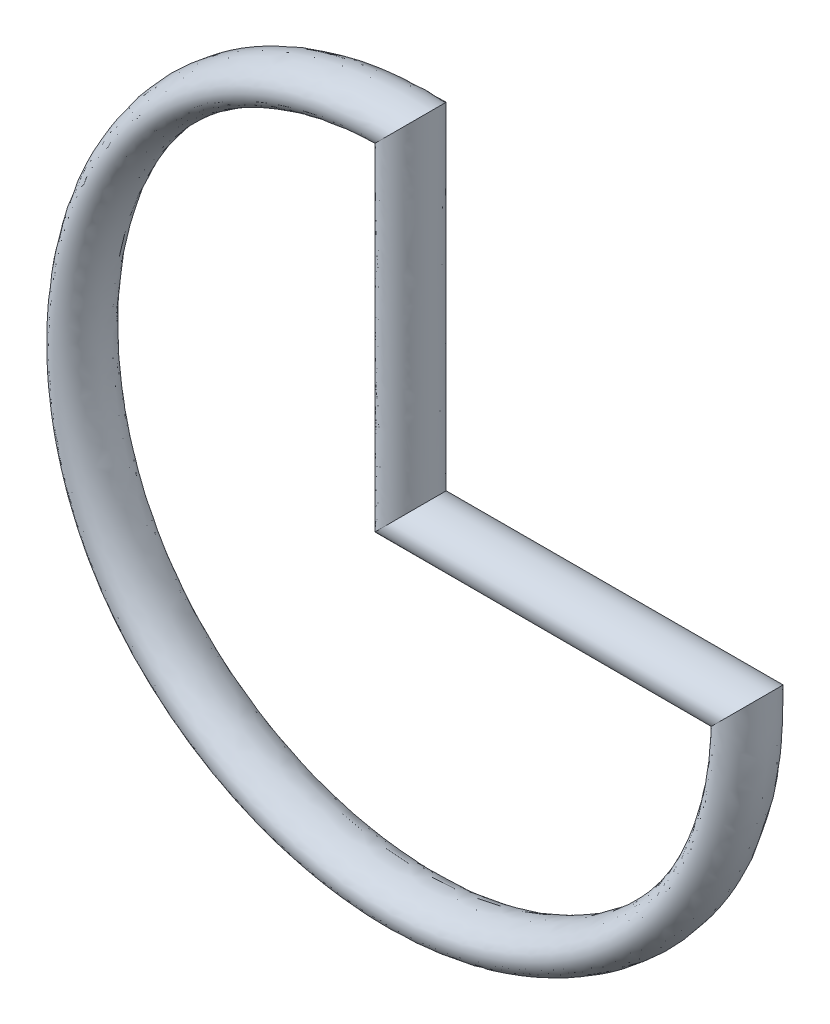
ISO-10303-21;
HEADER;
FILE_DESCRIPTION(('STEP AP214'),'2;1');
FILE_NAME('part.step','',(''),(''),'','','');
FILE_SCHEMA(('AUTOMOTIVE_DESIGN { 1 0 10303 214 1 1 1 1 }'));
ENDSEC;
DATA;
#1=APPLICATION_CONTEXT('core data for automotive mechanical design processes');
#2=APPLICATION_PROTOCOL_DEFINITION('international standard','automotive_design',2000,#1);
#3=PRODUCT_CONTEXT('',#1,'mechanical');
#4=PRODUCT('Part','Part','',(#3));
#5=PRODUCT_RELATED_PRODUCT_CATEGORY('part','',(#4));
#6=PRODUCT_DEFINITION_FORMATION('','',#4);
#7=PRODUCT_DEFINITION_CONTEXT('part definition',#1,'design');
#8=PRODUCT_DEFINITION('design','',#6,#7);
#9=PRODUCT_DEFINITION_SHAPE('','',#8);
#10=(LENGTH_UNIT() NAMED_UNIT(*) SI_UNIT(.MILLI.,.METRE.));
#11=(NAMED_UNIT(*) PLANE_ANGLE_UNIT() SI_UNIT($,.RADIAN.));
#12=(NAMED_UNIT(*) SI_UNIT($,.STERADIAN.) SOLID_ANGLE_UNIT());
#13=UNCERTAINTY_MEASURE_WITH_UNIT(LENGTH_MEASURE(1.E-05),#10,'distance_accuracy_value','');
#14=(GEOMETRIC_REPRESENTATION_CONTEXT(3) GLOBAL_UNCERTAINTY_ASSIGNED_CONTEXT((#13)) GLOBAL_UNIT_ASSIGNED_CONTEXT((#10,
#11,#12)) REPRESENTATION_CONTEXT('',''));
#15=CARTESIAN_POINT('',(0.,0.,0.));
#16=DIRECTION('',(0.,0.,1.));
#17=DIRECTION('',(1.,0.,0.));
#18=AXIS2_PLACEMENT_3D('',#15,#16,#17);
#19=CARTESIAN_POINT('',(0.0176776695296638,-0.217677669529664,0.));
#20=CARTESIAN_POINT('',(0.0176776695296638,0.471479339474909,0.));
#21=CARTESIAN_POINT('',(0.0176776695296638,-0.217677669529664,0.05));
#22=CARTESIAN_POINT('',(0.0176776695296638,0.471479339474909,0.05));
#23=CARTESIAN_POINT('',(-0.0176776695296638,-0.182322330470336,0.05));
#24=CARTESIAN_POINT('',(-0.0176776695296638,0.506834678534236,0.05));
#25=CARTESIAN_POINT('',(-0.0176776695296638,-0.182322330470336,0.));
#26=CARTESIAN_POINT('',(-0.0176776695296638,0.506834678534236,0.));
#27=CARTESIAN_POINT('',(-0.0176776695296638,-0.182322330470336,-0.05));
#28=CARTESIAN_POINT('',(-0.0176776695296638,0.506834678534236,-0.05));
#29=CARTESIAN_POINT('',(0.0176776695296638,-0.217677669529664,-0.05));
#30=CARTESIAN_POINT('',(0.0176776695296638,0.471479339474909,-0.05));
#31=CARTESIAN_POINT('',(0.0176776695296638,-0.217677669529664,0.));
#32=CARTESIAN_POINT('',(0.0176776695296638,0.471479339474909,0.));
#33=(BOUNDED_SURFACE() B_SPLINE_SURFACE(3,1,((#19,#20),(#21,#22),(#23,#24),(#25,#26),(#27,#28),
(#29,#30),(#31,#32)),.UNSPECIFIED.,.T.,.F.,.F.) B_SPLINE_SURFACE_WITH_KNOTS((4,3,4),(2,2),(0.,
0.5,1.),(0.,1.),.UNSPECIFIED.) GEOMETRIC_REPRESENTATION_ITEM() RATIONAL_B_SPLINE_SURFACE(((1.,
1.),(0.333333333333333,0.333333333333333),(0.333333333333333,0.333333333333333),(1.,1.),
(0.333333333333333,0.333333333333333),(0.333333333333333,0.333333333333333),(1.,1.))) REPRESENTATION_ITEM('') SURFACE());
#34=CARTESIAN_POINT('',(0.,0.,0.));
#35=DIRECTION('',(0.707106781186552,-0.707106781186543,0.));
#36=DIRECTION('',(0.707106781186543,0.707106781186552,0.));
#37=AXIS2_PLACEMENT_3D('',#34,#35,#36);
#38=CIRCLE('',#37,0.025);
#39=CARTESIAN_POINT('',(0.0176776695296637,0.0176776695296638,0.));
#40=VERTEX_POINT('',#39);
#41=EDGE_CURVE('E60',#40,#40,#38,.T.);
#42=CARTESIAN_POINT('',(0.,0.289157009004573,0.));
#43=DIRECTION('',(0.707106781186552,-0.707106781186543,0.));
#44=DIRECTION('',(0.707106781186543,0.707106781186552,0.));
#45=AXIS2_PLACEMENT_3D('',#42,#43,#44);
#46=CIRCLE('',#45,0.025);
#47=CARTESIAN_POINT('',(0.0176776695296637,0.306834678534236,0.));
#48=VERTEX_POINT('',#47);
#49=EDGE_CURVE('E55',#48,#48,#46,.T.);
#50=ORIENTED_EDGE('',*,*,#41,.F.);
#51=EDGE_LOOP('',(#50));
#52=FACE_BOUND('',#51,.T.);
#53=ORIENTED_EDGE('',*,*,#49,.T.);
#54=EDGE_LOOP('',(#53));
#55=FACE_BOUND('',#54,.T.);
#56=ADVANCED_FACE('F45',(#52,#55),#33,.F.);
#57=CARTESIAN_POINT('',(0.306834678534236,0.0176776695296638,0.));
#58=CARTESIAN_POINT('',(0.0176776695296635,0.0176776695296638,0.));
#59=CARTESIAN_POINT('',(0.306834678534236,0.0176776695296638,0.05));
#60=CARTESIAN_POINT('',(0.0176776695296636,0.0176776695296638,0.05));
#61=CARTESIAN_POINT('',(0.271479339474909,-0.0176776695296638,0.05));
#62=CARTESIAN_POINT('',(-0.0176776695296636,-0.0176776695296638,0.05));
#63=CARTESIAN_POINT('',(0.271479339474909,-0.0176776695296638,0.));
#64=CARTESIAN_POINT('',(-0.0176776695296636,-0.0176776695296638,0.));
#65=CARTESIAN_POINT('',(0.271479339474909,-0.0176776695296638,-0.05));
#66=CARTESIAN_POINT('',(-0.0176776695296636,-0.0176776695296638,-0.05));
#67=CARTESIAN_POINT('',(0.306834678534236,0.0176776695296638,-0.05));
#68=CARTESIAN_POINT('',(0.0176776695296636,0.0176776695296638,-0.05));
#69=CARTESIAN_POINT('',(0.306834678534236,0.0176776695296638,0.));
#70=CARTESIAN_POINT('',(0.0176776695296635,0.0176776695296638,0.));
#71=(BOUNDED_SURFACE() B_SPLINE_SURFACE(3,1,((#57,#58),(#59,#60),(#61,#62),(#63,#64),(#65,#66),
(#67,#68),(#69,#70)),.UNSPECIFIED.,.T.,.F.,.F.) B_SPLINE_SURFACE_WITH_KNOTS((4,3,4),(2,2),(0.,
0.5,1.),(0.,1.),.UNSPECIFIED.) GEOMETRIC_REPRESENTATION_ITEM() RATIONAL_B_SPLINE_SURFACE(((1.,
1.),(0.333333333333333,0.333333333333333),(0.333333333333333,0.333333333333333),(1.,1.),
(0.333333333333333,0.333333333333333),(0.333333333333333,0.333333333333333),(1.,1.))) REPRESENTATION_ITEM('') SURFACE());
#72=CARTESIAN_POINT('',(0.307588855904687,0.0184318525656674,0.));
#73=CARTESIAN_POINT('',(0.307588442140184,0.0184314389987421,-0.00228138235617758));
#74=CARTESIAN_POINT('',(0.307351140834626,0.0181941335101052,-0.00456446048784308));
#75=CARTESIAN_POINT('',(0.306352569672693,0.0171955587202148,-0.00928990774502268));
#76=CARTESIAN_POINT('',(0.305513794045936,0.0163567845103321,-0.0116996400396007));
#77=CARTESIAN_POINT('',(0.303312909803522,0.0141559013482563,-0.0160993310885314));
#78=CARTESIAN_POINT('',(0.301933783834519,0.0127767749806945,-0.0180719889062247));
#79=CARTESIAN_POINT('',(0.298725329886001,0.00956832072135534,-0.0214370679595718));
#80=CARTESIAN_POINT('',(0.296873430407738,0.0077164213624369,-0.0227860486977412));
#81=CARTESIAN_POINT('',(0.292866593795671,0.00370958483582984,-0.0246320580256332));
#82=CARTESIAN_POINT('',(0.290701588595511,0.00154457959442521,-0.0250866950215473));
#83=CARTESIAN_POINT('',(0.286471052387676,-0.00268595662459014,-0.0248874304697885));
#84=CARTESIAN_POINT('',(0.284404619604599,-0.00475238937994638,-0.0242701767915893));
#85=CARTESIAN_POINT('',(0.28052043901278,-0.00863657001482794,-0.0221362446850032));
#86=CARTESIAN_POINT('',(0.278703053112835,-0.0104539559856962,-0.0206182740659246));
#87=CARTESIAN_POINT('',(0.275468775940526,-0.0136882331611209,-0.016769669567308));
#88=CARTESIAN_POINT('',(0.274064228084675,-0.0150927809453064,-0.0144179004067161));
#89=CARTESIAN_POINT('',(0.271990526062095,-0.0171664829181846,-0.0092656926604513));
#90=CARTESIAN_POINT('',(0.27129178826337,-0.0178652207348995,-0.0064894901958799));
#91=CARTESIAN_POINT('',(0.270676937379016,-0.0184800716314522,-0.000955270811405133));
#92=CARTESIAN_POINT('',(0.270712233964348,-0.0184447750418195,0.00179186289976565));
#93=CARTESIAN_POINT('',(0.271428244307559,-0.0177287646954634,0.00702638644621134));
#94=CARTESIAN_POINT('',(0.272090567769547,-0.0170664412344794,0.00951894239526535));
#95=CARTESIAN_POINT('',(0.273957481939246,-0.0151995270658887,0.0141478059193135));
#96=CARTESIAN_POINT('',(0.275177170721918,-0.0139798382832954,0.0162717562253384));
#97=CARTESIAN_POINT('',(0.27809956441794,-0.0110574445859507,0.0200139126344512));
#98=CARTESIAN_POINT('',(0.279828004089238,-0.00932900491315805,0.0215914838062708));
#99=CARTESIAN_POINT('',(0.283644110387583,-0.00551289861927556,0.0239675169829038));
#100=CARTESIAN_POINT('',(0.285745432270411,-0.00341157674278154,0.0247230041002524));
#101=CARTESIAN_POINT('',(0.289971700216623,0.000814691214449004,0.0251433367965496));
#102=CARTESIAN_POINT('',(0.292095858412714,0.00293884942755021,0.0248238821976317));
#103=CARTESIAN_POINT('',(0.296109628255303,0.00695261923319442,0.0232462262569654));
#104=CARTESIAN_POINT('',(0.298003080485771,0.00884607141111891,0.0220069232826995));
#105=CARTESIAN_POINT('',(0.301496983721315,0.0123399749998873,0.0186619269886865));
#106=CARTESIAN_POINT('',(0.303079817538676,0.0139228092443395,0.0165187889062634));
#107=CARTESIAN_POINT('',(0.305555694972274,0.016398685284331,0.0116572239522556));
#108=CARTESIAN_POINT('',(0.306472565545227,0.017315554121,0.00896362395733287));
#109=CARTESIAN_POINT('',(0.307394963929674,0.0182379566330311,0.00413455729902344));
#110=CARTESIAN_POINT('',(0.307589230964476,0.0184322274463602,0.00206797532881249));
#111=CARTESIAN_POINT('',(0.307588855904687,0.0184318525656674,0.));
#112=B_SPLINE_CURVE_WITH_KNOTS('',3,(#72,#73,#74,#75,#76,#77,#78,#79,#80,#81,#82,#83,#84,#85,
#86,#87,#88,#89,#90,#91,#92,#93,#94,#95,#96,#97,#98,#99,#100,#101,#102,#103,#104,#105,#106,#107,
#108,#109,#110,#111),.UNSPECIFIED.,.T.,.F.,(4,2,2,2,2,2,2,2,2,2,2,2,2,2,2,2,2,2,2,4),(0.,
0.00682494863499154,0.0147380166595046,0.0229234178124496,0.0316151517196782,0.0407097970105657,
0.0494995857144881,0.0583020150578078,0.0673457267692713,0.0759923204241758,0.0840684793577621,
0.0919148764572583,0.0999877188832668,0.108572727396436,0.117587678099275,0.126471537812964,
0.135177760938634,0.144286938233325,0.153051556883128,0.15923808031238),.UNSPECIFIED.);
#113=CARTESIAN_POINT('',(0.307211765768654,0.0180547595968904,0.));
#114=VERTEX_POINT('',#113);
#115=EDGE_CURVE('E12',#114,#114,#112,.T.);
#116=ORIENTED_EDGE('',*,*,#41,.T.);
#117=EDGE_LOOP('',(#116));
#118=FACE_BOUND('',#117,.T.);
#119=ORIENTED_EDGE('',*,*,#115,.T.);
#120=EDGE_LOOP('',(#119));
#121=FACE_BOUND('',#120,.T.);
#122=ADVANCED_FACE('F89',(#118,#121),#71,.F.);
#123=CARTESIAN_POINT('',(0.0176776695296636,0.306834678534236,0.));
#124=CARTESIAN_POINT('',(-0.264134510497059,0.323069197760971,0.));
#125=CARTESIAN_POINT('',(-0.389986917014371,-0.0243157556052428,0.));
#126=CARTESIAN_POINT('',(-0.149203864334944,-0.294539445039508,0.));
#127=CARTESIAN_POINT('',(-0.0189094824571877,-0.329476904824197,0.));
#128=CARTESIAN_POINT('',(0.209658583789563,-0.254864485243051,0.));
#129=CARTESIAN_POINT('',(0.302657229054855,-0.154462148316479,0.));
#130=CARTESIAN_POINT('',(0.308931983804661,0.0509955268040813,0.));
#131=CARTESIAN_POINT('',(0.306834678534236,0.115655663803662,0.));
#132=CARTESIAN_POINT('',(0.306834678534236,0.182322330470336,0.));
#133=CARTESIAN_POINT('',(0.0176776695296636,0.306834678534236,0.05));
#134=CARTESIAN_POINT('',(-0.264134510497059,0.323069197760971,0.05));
#135=CARTESIAN_POINT('',(-0.389986917014371,-0.0243157556052428,0.05));
#136=CARTESIAN_POINT('',(-0.149203864334944,-0.294539445039508,0.05));
#137=CARTESIAN_POINT('',(-0.0189094824571877,-0.329476904824197,0.05));
#138=CARTESIAN_POINT('',(0.209658583789563,-0.254864485243051,0.05));
#139=CARTESIAN_POINT('',(0.302657229054855,-0.154462148316479,0.05));
#140=CARTESIAN_POINT('',(0.308931983804661,0.0509955268040813,0.05));
#141=CARTESIAN_POINT('',(0.306834678534236,0.115655663803662,0.05));
#142=CARTESIAN_POINT('',(0.306834678534236,0.182322330470336,0.05));
#143=CARTESIAN_POINT('',(-0.0176776695296636,0.271479339474909,0.05));
#144=CARTESIAN_POINT('',(-0.267017587967985,0.255241948270952,0.05));
#145=CARTESIAN_POINT('',(-0.339986917014371,-0.0635699379450338,0.05));
#146=CARTESIAN_POINT('',(-0.0992038643349442,-0.274912353869612,0.05));
#147=CARTESIAN_POINT('',(0.0190460031692673,-0.2915047267576,0.05));
#148=CARTESIAN_POINT('',(0.211776704614099,-0.20121730909881,0.05));
#149=CARTESIAN_POINT('',(0.275427536950894,-0.111009193032695,0.05));
#150=CARTESIAN_POINT('',(0.269497131092514,0.0822854251514972,0.05));
#151=CARTESIAN_POINT('',(0.271479339474909,0.151011002862989,0.05));
#152=CARTESIAN_POINT('',(0.271479339474909,0.217677669529664,0.05));
#153=CARTESIAN_POINT('',(-0.0176776695296636,0.271479339474909,0.));
#154=CARTESIAN_POINT('',(-0.267017587967985,0.255241948270952,0.));
#155=CARTESIAN_POINT('',(-0.339986917014371,-0.0635699379450338,0.));
#156=CARTESIAN_POINT('',(-0.0992038643349442,-0.274912353869612,0.));
#157=CARTESIAN_POINT('',(0.0190460031692673,-0.2915047267576,0.));
#158=CARTESIAN_POINT('',(0.211776704614099,-0.20121730909881,0.));
#159=CARTESIAN_POINT('',(0.275427536950894,-0.111009193032695,0.));
#160=CARTESIAN_POINT('',(0.269497131092514,0.0822854251514972,0.));
#161=CARTESIAN_POINT('',(0.271479339474909,0.151011002862989,0.));
#162=CARTESIAN_POINT('',(0.271479339474909,0.217677669529664,0.));
#163=CARTESIAN_POINT('',(-0.0176776695296636,0.271479339474909,-0.05));
#164=CARTESIAN_POINT('',(-0.267017587967985,0.255241948270952,-0.05));
#165=CARTESIAN_POINT('',(-0.339986917014371,-0.0635699379450338,-0.05));
#166=CARTESIAN_POINT('',(-0.0992038643349442,-0.274912353869612,-0.05));
#167=CARTESIAN_POINT('',(0.0190460031692673,-0.2915047267576,-0.05));
#168=CARTESIAN_POINT('',(0.211776704614099,-0.20121730909881,-0.05));
#169=CARTESIAN_POINT('',(0.275427536950894,-0.111009193032695,-0.05));
#170=CARTESIAN_POINT('',(0.269497131092514,0.0822854251514972,-0.05));
#171=CARTESIAN_POINT('',(0.271479339474909,0.151011002862989,-0.05));
#172=CARTESIAN_POINT('',(0.271479339474909,0.217677669529664,-0.05));
#173=CARTESIAN_POINT('',(0.0176776695296636,0.306834678534236,-0.05));
#174=CARTESIAN_POINT('',(-0.264134510497059,0.323069197760971,-0.05));
#175=CARTESIAN_POINT('',(-0.389986917014371,-0.0243157556052428,-0.05));
#176=CARTESIAN_POINT('',(-0.149203864334944,-0.294539445039508,-0.05));
#177=CARTESIAN_POINT('',(-0.0189094824571877,-0.329476904824197,-0.05));
#178=CARTESIAN_POINT('',(0.209658583789563,-0.254864485243051,-0.05));
#179=CARTESIAN_POINT('',(0.302657229054855,-0.154462148316479,-0.05));
#180=CARTESIAN_POINT('',(0.308931983804661,0.0509955268040813,-0.05));
#181=CARTESIAN_POINT('',(0.306834678534236,0.115655663803662,-0.05));
#182=CARTESIAN_POINT('',(0.306834678534236,0.182322330470336,-0.05));
#183=CARTESIAN_POINT('',(0.0176776695296636,0.306834678534236,0.));
#184=CARTESIAN_POINT('',(-0.264134510497059,0.323069197760971,0.));
#185=CARTESIAN_POINT('',(-0.389986917014371,-0.0243157556052428,0.));
#186=CARTESIAN_POINT('',(-0.149203864334944,-0.294539445039508,0.));
#187=CARTESIAN_POINT('',(-0.0189094824571877,-0.329476904824197,0.));
#188=CARTESIAN_POINT('',(0.209658583789563,-0.254864485243051,0.));
#189=CARTESIAN_POINT('',(0.302657229054855,-0.154462148316479,0.));
#190=CARTESIAN_POINT('',(0.308931983804661,0.0509955268040813,0.));
#191=CARTESIAN_POINT('',(0.306834678534236,0.115655663803662,0.));
#192=CARTESIAN_POINT('',(0.306834678534236,0.182322330470336,0.));
#193=(BOUNDED_SURFACE() B_SPLINE_SURFACE(3,3,((#123,#124,#125,#126,#127,#128,#129,#130,#131,
#132),(#133,#134,#135,#136,#137,#138,#139,#140,#141,#142),(#143,#144,#145,#146,#147,#148,#149,
#150,#151,#152),(#153,#154,#155,#156,#157,#158,#159,#160,#161,#162),(#163,#164,#165,#166,#167,
#168,#169,#170,#171,#172),(#173,#174,#175,#176,#177,#178,#179,#180,#181,#182),(#183,#184,#185,
#186,#187,#188,#189,#190,#191,#192)),.UNSPECIFIED.,.T.,.F.,.F.) B_SPLINE_SURFACE_WITH_KNOTS((4,
3,4),(4,2,2,2,4),(0.,0.5,1.),(0.,0.5,0.75,1.,1.12551350296252),
.UNSPECIFIED.) GEOMETRIC_REPRESENTATION_ITEM() RATIONAL_B_SPLINE_SURFACE(((1.,1.,1.,1.,1.,1.,1.,
1.,1.,1.),(0.333333333333333,0.333333333333333,0.333333333333333,0.333333333333333,
0.333333333333333,0.333333333333333,0.333333333333333,0.333333333333333,0.333333333333333,
0.333333333333333),(0.333333333333333,0.333333333333333,0.333333333333333,0.333333333333333,
0.333333333333333,0.333333333333333,0.333333333333333,0.333333333333333,0.333333333333333,
0.333333333333333),(1.,1.,1.,1.,1.,1.,1.,1.,1.,1.),(0.333333333333333,0.333333333333333,
0.333333333333333,0.333333333333333,0.333333333333333,0.333333333333333,0.333333333333333,
0.333333333333333,0.333333333333333,0.333333333333333),(0.333333333333333,0.333333333333333,
0.333333333333333,0.333333333333333,0.333333333333333,0.333333333333333,0.333333333333333,
0.333333333333333,0.333333333333333,0.333333333333333),(1.,1.,1.,1.,1.,1.,1.,1.,1.,1.))) REPRESENTATION_ITEM('') SURFACE());
#194=ORIENTED_EDGE('',*,*,#49,.F.);
#195=EDGE_LOOP('',(#194));
#196=FACE_BOUND('',#195,.T.);
#197=ORIENTED_EDGE('',*,*,#115,.F.);
#198=EDGE_LOOP('',(#197));
#199=FACE_BOUND('',#198,.T.);
#200=ADVANCED_FACE('F69',(#196,#199),#193,.F.);
#201=CLOSED_SHELL('',(#56,#122,#200));
#202=MANIFOLD_SOLID_BREP('B2',#201);
#203=ADVANCED_BREP_SHAPE_REPRESENTATION('',(#18,#202),#14);
#204=SHAPE_DEFINITION_REPRESENTATION(#9,#203);
ENDSEC;
END-ISO-10303-21;
